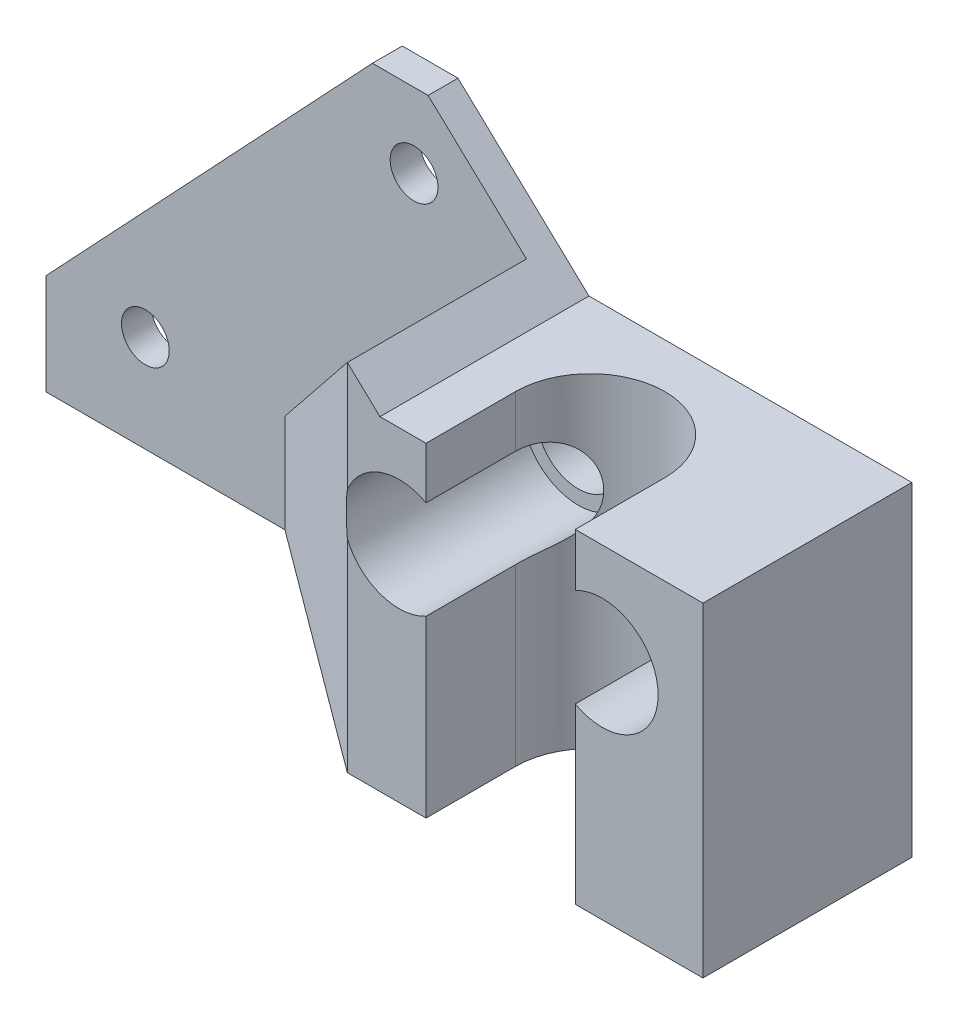
ISO-10303-21;
HEADER;
FILE_DESCRIPTION(('STEP AP214'),'2;1');
FILE_NAME('part.step','',(''),(''),'','','');
FILE_SCHEMA(('AUTOMOTIVE_DESIGN { 1 0 10303 214 1 1 1 1 }'));
ENDSEC;
DATA;
#1=APPLICATION_CONTEXT('core data for automotive mechanical design processes');
#2=APPLICATION_PROTOCOL_DEFINITION('international standard','automotive_design',2000,#1);
#3=PRODUCT_CONTEXT('',#1,'mechanical');
#4=PRODUCT('Part','Part','',(#3));
#5=PRODUCT_RELATED_PRODUCT_CATEGORY('part','',(#4));
#6=PRODUCT_DEFINITION_FORMATION('','',#4);
#7=PRODUCT_DEFINITION_CONTEXT('part definition',#1,'design');
#8=PRODUCT_DEFINITION('design','',#6,#7);
#9=PRODUCT_DEFINITION_SHAPE('','',#8);
#10=(LENGTH_UNIT() NAMED_UNIT(*) SI_UNIT(.MILLI.,.METRE.));
#11=(NAMED_UNIT(*) PLANE_ANGLE_UNIT() SI_UNIT($,.RADIAN.));
#12=(NAMED_UNIT(*) SI_UNIT($,.STERADIAN.) SOLID_ANGLE_UNIT());
#13=UNCERTAINTY_MEASURE_WITH_UNIT(LENGTH_MEASURE(1.E-05),#10,'distance_accuracy_value','');
#14=(GEOMETRIC_REPRESENTATION_CONTEXT(3) GLOBAL_UNCERTAINTY_ASSIGNED_CONTEXT((#13)) GLOBAL_UNIT_ASSIGNED_CONTEXT((#10,
#11,#12)) REPRESENTATION_CONTEXT('',''));
#15=CARTESIAN_POINT('',(0.,0.,0.));
#16=DIRECTION('',(0.,0.,1.));
#17=DIRECTION('',(1.,0.,0.));
#18=AXIS2_PLACEMENT_3D('',#15,#16,#17);
#19=CARTESIAN_POINT('',(0.,0.,14.));
#20=DIRECTION('',(0.,0.,1.));
#21=DIRECTION('',(1.,0.,0.));
#22=AXIS2_PLACEMENT_3D('',#19,#20,#21);
#23=PLANE('',#22);
#24=DIRECTION('',(0.,1.,0.));
#25=VECTOR('',#24,1.);
#26=CARTESIAN_POINT('',(7.51866515560034,0.477324022586538,14.));
#27=LINE('',#26,#25);
#28=CARTESIAN_POINT('',(7.51866515560034,0.477324022586538,14.));
#29=VERTEX_POINT('',#28);
#30=CARTESIAN_POINT('',(7.51866515560034,14.0531464838984,14.));
#31=VERTEX_POINT('',#30);
#32=EDGE_CURVE('E57',#29,#31,#27,.T.);
#33=ORIENTED_EDGE('',*,*,#32,.F.);
#34=DIRECTION('',(1.,0.,0.));
#35=VECTOR('',#34,1.);
#36=CARTESIAN_POINT('',(-8.66256915309688,0.477324022586538,14.));
#37=LINE('',#36,#35);
#38=CARTESIAN_POINT('',(12.787295144378,0.477324022586538,14.));
#39=VERTEX_POINT('',#38);
#40=EDGE_CURVE('E181',#29,#39,#37,.T.);
#41=ORIENTED_EDGE('',*,*,#40,.T.);
#42=DIRECTION('',(0.,1.,0.));
#43=VECTOR('',#42,1.);
#44=CARTESIAN_POINT('',(12.787295144378,0.477324022586538,14.));
#45=LINE('',#44,#43);
#46=CARTESIAN_POINT('',(12.787295144378,12.187344478267,14.));
#47=VERTEX_POINT('',#46);
#48=EDGE_CURVE('E359',#39,#47,#45,.T.);
#49=ORIENTED_EDGE('',*,*,#48,.T.);
#50=CARTESIAN_POINT('',(10.9877022465373,15.4773240225865,14.));
#51=DIRECTION('',(0.,0.,1.));
#52=DIRECTION('',(1.,0.,0.));
#53=AXIS2_PLACEMENT_3D('',#50,#51,#52);
#54=CIRCLE('',#53,3.75);
#55=EDGE_CURVE('E183',#31,#47,#54,.T.);
#56=ORIENTED_EDGE('',*,*,#55,.F.);
#57=EDGE_LOOP('',(#33,#41,#49,#56));
#58=FACE_BOUND('',#57,.T.);
#59=ADVANCED_FACE('F42',(#58),#23,.T.);
#60=CARTESIAN_POINT('',(7.51866515560034,16.9015015612747,14.));
#61=VERTEX_POINT('',#60);
#62=CARTESIAN_POINT('',(7.51866515560034,24.2822957667511,14.));
#63=VERTEX_POINT('',#62);
#64=EDGE_CURVE('E176',#61,#63,#27,.T.);
#65=ORIENTED_EDGE('',*,*,#64,.F.);
#66=CARTESIAN_POINT('',(12.787295144378,18.7673035669061,14.));
#67=VERTEX_POINT('',#66);
#68=EDGE_CURVE('E217',#67,#61,#54,.T.);
#69=ORIENTED_EDGE('',*,*,#68,.F.);
#70=CARTESIAN_POINT('',(12.787295144378,22.2273240225865,14.));
#71=VERTEX_POINT('',#70);
#72=EDGE_CURVE('E495',#67,#71,#45,.T.);
#73=ORIENTED_EDGE('',*,*,#72,.T.);
#74=DIRECTION('',(-1.,0.,0.));
#75=VECTOR('',#74,1.);
#76=CARTESIAN_POINT('',(9.70432092234068,22.2273240225866,14.));
#77=LINE('',#76,#75);
#78=CARTESIAN_POINT('',(9.70432092234068,22.2273240225866,14.));
#79=VERTEX_POINT('',#78);
#80=EDGE_CURVE('E199',#71,#79,#77,.T.);
#81=ORIENTED_EDGE('',*,*,#80,.T.);
#82=DIRECTION('',(-0.728551922246781,0.684990581388183,0.));
#83=VECTOR('',#82,1.);
#84=CARTESIAN_POINT('',(7.51866515560034,24.2822957667511,14.));
#85=LINE('',#84,#83);
#86=EDGE_CURVE('E210',#79,#63,#85,.T.);
#87=ORIENTED_EDGE('',*,*,#86,.T.);
#88=EDGE_LOOP('',(#65,#69,#73,#81,#87));
#89=FACE_BOUND('',#88,.T.);
#90=ADVANCED_FACE('F375',(#89),#23,.T.);
#91=CARTESIAN_POINT('',(0.,0.,2.));
#92=DIRECTION('',(0.,0.,-1.));
#93=DIRECTION('',(-1.,0.,0.));
#94=AXIS2_PLACEMENT_3D('',#91,#92,#93);
#95=PLANE('',#94);
#96=CARTESIAN_POINT('',(10.9877022465373,15.4773240225865,2.));
#97=DIRECTION('',(0.,0.,1.));
#98=DIRECTION('',(1.,0.,0.));
#99=AXIS2_PLACEMENT_3D('',#96,#97,#98);
#100=CIRCLE('',#99,2.8);
#101=CARTESIAN_POINT('',(13.7877022465373,15.4773240225865,2.));
#102=VERTEX_POINT('',#101);
#103=EDGE_CURVE('E242',#102,#102,#100,.T.);
#104=ORIENTED_EDGE('',*,*,#103,.F.);
#105=EDGE_LOOP('',(#104));
#106=FACE_BOUND('',#105,.T.);
#107=CARTESIAN_POINT('',(10.9877022465373,15.4773240225865,2.));
#108=DIRECTION('',(0.,0.,1.));
#109=DIRECTION('',(1.,0.,0.));
#110=AXIS2_PLACEMENT_3D('',#107,#108,#109);
#111=CIRCLE('',#110,3.75);
#112=CARTESIAN_POINT('',(14.7377022465373,15.4773240225865,2.));
#113=VERTEX_POINT('',#112);
#114=EDGE_CURVE('E203',#113,#113,#111,.T.);
#115=ORIENTED_EDGE('',*,*,#114,.T.);
#116=EDGE_LOOP('',(#115));
#117=FACE_BOUND('',#116,.T.);
#118=ADVANCED_FACE('F400',(#106,#117),#95,.F.);
#119=CARTESIAN_POINT('',(24.5874308469031,15.3914054774941,2.));
#120=DIRECTION('',(0.,0.,1.));
#121=DIRECTION('',(1.,0.,0.));
#122=AXIS2_PLACEMENT_3D('',#119,#120,#121);
#123=CIRCLE('',#122,2.8);
#124=CARTESIAN_POINT('',(27.3874308469031,15.3914054774941,2.));
#125=VERTEX_POINT('',#124);
#126=EDGE_CURVE('E250',#125,#125,#123,.T.);
#127=ORIENTED_EDGE('',*,*,#126,.F.);
#128=EDGE_LOOP('',(#127));
#129=FACE_BOUND('',#128,.T.);
#130=CARTESIAN_POINT('',(24.5874308469031,15.3914054774941,2.));
#131=DIRECTION('',(0.,0.,1.));
#132=DIRECTION('',(1.,0.,0.));
#133=AXIS2_PLACEMENT_3D('',#130,#131,#132);
#134=CIRCLE('',#133,3.75);
#135=CARTESIAN_POINT('',(28.3374308469031,15.3914054774941,2.));
#136=VERTEX_POINT('',#135);
#137=EDGE_CURVE('E358',#136,#136,#134,.T.);
#138=ORIENTED_EDGE('',*,*,#137,.T.);
#139=EDGE_LOOP('',(#138));
#140=FACE_BOUND('',#139,.T.);
#141=ADVANCED_FACE('F401',(#129,#140),#95,.F.);
#142=CARTESIAN_POINT('',(-24.6625691530969,0.477324022586537,2.));
#143=DIRECTION('',(1.,0.,0.));
#144=DIRECTION('',(0.,1.,0.));
#145=AXIS2_PLACEMENT_3D('',#142,#143,#144);
#146=PLANE('',#145);
#147=DIRECTION('',(0.,-1.,0.));
#148=VECTOR('',#147,1.);
#149=CARTESIAN_POINT('',(-24.6625691530969,0.477324022586537,0.));
#150=LINE('',#149,#148);
#151=CARTESIAN_POINT('',(-24.6625691530969,7.22803975017506,0.));
#152=VERTEX_POINT('',#151);
#153=CARTESIAN_POINT('',(-24.6625691530969,0.477324022586537,0.));
#154=VERTEX_POINT('',#153);
#155=EDGE_CURVE('E229',#152,#154,#150,.T.);
#156=ORIENTED_EDGE('',*,*,#155,.T.);
#157=DIRECTION('',(0.,0.,-1.));
#158=VECTOR('',#157,1.);
#159=CARTESIAN_POINT('',(-24.6625691530969,0.477324022586537,2.));
#160=LINE('',#159,#158);
#161=CARTESIAN_POINT('',(-24.6625691530969,0.477324022586537,2.));
#162=VERTEX_POINT('',#161);
#163=EDGE_CURVE('E318',#162,#154,#160,.T.);
#164=ORIENTED_EDGE('',*,*,#163,.F.);
#165=DIRECTION('',(0.,-1.,0.));
#166=VECTOR('',#165,1.);
#167=CARTESIAN_POINT('',(-24.6625691530969,0.477324022586537,2.));
#168=LINE('',#167,#166);
#169=CARTESIAN_POINT('',(-24.6625691530969,7.22803975017506,2.));
#170=VERTEX_POINT('',#169);
#171=EDGE_CURVE('E257',#170,#162,#168,.T.);
#172=ORIENTED_EDGE('',*,*,#171,.F.);
#173=DIRECTION('',(0.,0.,-1.));
#174=VECTOR('',#173,1.);
#175=CARTESIAN_POINT('',(-24.6625691530969,7.22803975017506,2.));
#176=LINE('',#175,#174);
#177=EDGE_CURVE('E274',#170,#152,#176,.T.);
#178=ORIENTED_EDGE('',*,*,#177,.T.);
#179=EDGE_LOOP('',(#156,#164,#172,#178));
#180=FACE_BOUND('',#179,.T.);
#181=ADVANCED_FACE('F44',(#180),#146,.F.);
#182=CARTESIAN_POINT('',(31.3374308469031,0.477324022586544,2.));
#183=DIRECTION('',(0.,1.,0.));
#184=DIRECTION('',(-1.,0.,0.));
#185=AXIS2_PLACEMENT_3D('',#182,#183,#184);
#186=PLANE('',#185);
#187=ORIENTED_EDGE('',*,*,#40,.F.);
#188=DIRECTION('',(-0.80322703688455,0.,-0.595673003599849));
#189=VECTOR('',#188,1.);
#190=CARTESIAN_POINT('',(-8.66256915309688,0.477324022586538,2.));
#191=LINE('',#190,#189);
#192=CARTESIAN_POINT('',(-8.66256915309688,0.477324022586538,2.));
#193=VERTEX_POINT('',#192);
#194=EDGE_CURVE('E168',#29,#193,#191,.T.);
#195=ORIENTED_EDGE('',*,*,#194,.T.);
#196=DIRECTION('',(1.,0.,0.));
#197=VECTOR('',#196,1.);
#198=CARTESIAN_POINT('',(31.3374308469031,0.477324022586544,2.));
#199=LINE('',#198,#197);
#200=EDGE_CURVE('E261',#162,#193,#199,.T.);
#201=ORIENTED_EDGE('',*,*,#200,.F.);
#202=ORIENTED_EDGE('',*,*,#163,.T.);
#203=DIRECTION('',(1.,0.,0.));
#204=VECTOR('',#203,1.);
#205=CARTESIAN_POINT('',(31.3374308469031,0.477324022586544,0.));
#206=LINE('',#205,#204);
#207=CARTESIAN_POINT('',(31.3374308469031,0.477324022586544,0.));
#208=VERTEX_POINT('',#207);
#209=EDGE_CURVE('E278',#154,#208,#206,.T.);
#210=ORIENTED_EDGE('',*,*,#209,.T.);
#211=DIRECTION('',(0.,0.,-1.));
#212=VECTOR('',#211,1.);
#213=CARTESIAN_POINT('',(31.3374308469031,0.477324022586544,2.));
#214=LINE('',#213,#212);
#215=CARTESIAN_POINT('',(31.3374308469031,0.477324022586544,14.));
#216=VERTEX_POINT('',#215);
#217=EDGE_CURVE('E314',#216,#208,#214,.T.);
#218=ORIENTED_EDGE('',*,*,#217,.F.);
#219=CARTESIAN_POINT('',(22.787295144378,0.477324022586538,14.));
#220=VERTEX_POINT('',#219);
#221=EDGE_CURVE('E194',#220,#216,#37,.T.);
#222=ORIENTED_EDGE('',*,*,#221,.F.);
#223=DIRECTION('',(0.,0.,-1.));
#224=VECTOR('',#223,1.);
#225=CARTESIAN_POINT('',(22.787295144378,0.477324022586538,14.));
#226=LINE('',#225,#224);
#227=CARTESIAN_POINT('',(22.787295144378,0.477324022586538,8.));
#228=VERTEX_POINT('',#227);
#229=EDGE_CURVE('E479',#220,#228,#226,.T.);
#230=ORIENTED_EDGE('',*,*,#229,.T.);
#231=CARTESIAN_POINT('',(17.787295144378,0.477324022586538,8.));
#232=DIRECTION('',(0.,1.,0.));
#233=DIRECTION('',(0.,0.,1.));
#234=AXIS2_PLACEMENT_3D('',#231,#232,#233);
#235=CIRCLE('',#234,5.);
#236=CARTESIAN_POINT('',(12.787295144378,0.477324022586538,8.));
#237=VERTEX_POINT('',#236);
#238=EDGE_CURVE('E476',#228,#237,#235,.T.);
#239=ORIENTED_EDGE('',*,*,#238,.T.);
#240=DIRECTION('',(0.,0.,1.));
#241=VECTOR('',#240,1.);
#242=CARTESIAN_POINT('',(12.787295144378,0.477324022586538,14.));
#243=LINE('',#242,#241);
#244=EDGE_CURVE('E191',#237,#39,#243,.T.);
#245=ORIENTED_EDGE('',*,*,#244,.T.);
#246=EDGE_LOOP('',(#187,#195,#201,#202,#210,#218,#222,#230,#239,#245));
#247=FACE_BOUND('',#246,.T.);
#248=ADVANCED_FACE('F188',(#247),#186,.F.);
#249=CARTESIAN_POINT('',(31.3374308469031,22.2273240225865,2.));
#250=DIRECTION('',(-1.,0.,0.));
#251=DIRECTION('',(0.,-1.,0.));
#252=AXIS2_PLACEMENT_3D('',#249,#250,#251);
#253=PLANE('',#252);
#254=DIRECTION('',(0.,1.,0.));
#255=VECTOR('',#254,1.);
#256=CARTESIAN_POINT('',(31.3374308469031,22.2273240225865,0.));
#257=LINE('',#256,#255);
#258=CARTESIAN_POINT('',(31.3374308469031,22.2273240225865,0.));
#259=VERTEX_POINT('',#258);
#260=EDGE_CURVE('E281',#208,#259,#257,.T.);
#261=ORIENTED_EDGE('',*,*,#260,.T.);
#262=DIRECTION('',(0.,0.,-1.));
#263=VECTOR('',#262,1.);
#264=CARTESIAN_POINT('',(31.3374308469031,22.2273240225865,2.));
#265=LINE('',#264,#263);
#266=CARTESIAN_POINT('',(31.3374308469031,22.2273240225865,14.));
#267=VERTEX_POINT('',#266);
#268=EDGE_CURVE('E310',#267,#259,#265,.T.);
#269=ORIENTED_EDGE('',*,*,#268,.F.);
#270=DIRECTION('',(0.,1.,0.));
#271=VECTOR('',#270,1.);
#272=CARTESIAN_POINT('',(31.3374308469031,0.477324022586544,14.));
#273=LINE('',#272,#271);
#274=EDGE_CURVE('E193',#216,#267,#273,.T.);
#275=ORIENTED_EDGE('',*,*,#274,.F.);
#276=ORIENTED_EDGE('',*,*,#217,.T.);
#277=EDGE_LOOP('',(#261,#269,#275,#276));
#278=FACE_BOUND('',#277,.T.);
#279=ADVANCED_FACE('F419',(#278),#253,.F.);
#280=CARTESIAN_POINT('',(9.70432092234068,22.2273240225865,2.));
#281=DIRECTION('',(0.,-1.,0.));
#282=DIRECTION('',(0.,0.,-1.));
#283=AXIS2_PLACEMENT_3D('',#280,#281,#282);
#284=PLANE('',#283);
#285=ORIENTED_EDGE('',*,*,#80,.F.);
#286=DIRECTION('',(0.,0.,1.));
#287=VECTOR('',#286,1.);
#288=CARTESIAN_POINT('',(12.787295144378,22.2273240225865,14.));
#289=LINE('',#288,#287);
#290=CARTESIAN_POINT('',(12.787295144378,22.2273240225865,8.));
#291=VERTEX_POINT('',#290);
#292=EDGE_CURVE('E490',#291,#71,#289,.T.);
#293=ORIENTED_EDGE('',*,*,#292,.F.);
#294=CARTESIAN_POINT('',(17.787295144378,22.2273240225865,8.));
#295=DIRECTION('',(0.,1.,0.));
#296=DIRECTION('',(0.,0.,1.));
#297=AXIS2_PLACEMENT_3D('',#294,#295,#296);
#298=CIRCLE('',#297,5.);
#299=CARTESIAN_POINT('',(22.787295144378,22.2273240225865,8.));
#300=VERTEX_POINT('',#299);
#301=EDGE_CURVE('E486',#300,#291,#298,.T.);
#302=ORIENTED_EDGE('',*,*,#301,.F.);
#303=DIRECTION('',(0.,0.,-1.));
#304=VECTOR('',#303,1.);
#305=CARTESIAN_POINT('',(22.787295144378,22.2273240225865,14.));
#306=LINE('',#305,#304);
#307=CARTESIAN_POINT('',(22.787295144378,22.2273240225865,14.));
#308=VERTEX_POINT('',#307);
#309=EDGE_CURVE('E483',#308,#300,#306,.T.);
#310=ORIENTED_EDGE('',*,*,#309,.F.);
#311=EDGE_CURVE('E206',#267,#308,#77,.T.);
#312=ORIENTED_EDGE('',*,*,#311,.F.);
#313=ORIENTED_EDGE('',*,*,#268,.T.);
#314=DIRECTION('',(-1.,0.,0.));
#315=VECTOR('',#314,1.);
#316=CARTESIAN_POINT('',(9.70432092234068,22.2273240225865,0.));
#317=LINE('',#316,#315);
#318=CARTESIAN_POINT('',(9.70432092234068,22.2273240225865,0.));
#319=VERTEX_POINT('',#318);
#320=EDGE_CURVE('E284',#259,#319,#317,.T.);
#321=ORIENTED_EDGE('',*,*,#320,.T.);
#322=DIRECTION('',(0.,0.,-1.));
#323=VECTOR('',#322,1.);
#324=CARTESIAN_POINT('',(9.70432092234068,22.2273240225865,2.));
#325=LINE('',#324,#323);
#326=EDGE_CURVE('E306',#79,#319,#325,.T.);
#327=ORIENTED_EDGE('',*,*,#326,.F.);
#328=EDGE_LOOP('',(#285,#293,#302,#310,#312,#313,#321,#327));
#329=FACE_BOUND('',#328,.T.);
#330=ADVANCED_FACE('F415',(#329),#284,.F.);
#331=CARTESIAN_POINT('',(0.929669822240732,30.4773240225865,2.));
#332=DIRECTION('',(-0.684990581388184,-0.72855192224678,0.));
#333=DIRECTION('',(0.72855192224678,-0.684990581388184,0.));
#334=AXIS2_PLACEMENT_3D('',#331,#332,#333);
#335=PLANE('',#334);
#336=DIRECTION('',(-0.72855192224678,0.684990581388184,0.));
#337=VECTOR('',#336,1.);
#338=CARTESIAN_POINT('',(0.929669822240732,30.4773240225865,0.));
#339=LINE('',#338,#337);
#340=CARTESIAN_POINT('',(0.929669822240732,30.4773240225865,0.));
#341=VERTEX_POINT('',#340);
#342=EDGE_CURVE('E287',#319,#341,#339,.T.);
#343=ORIENTED_EDGE('',*,*,#342,.T.);
#344=DIRECTION('',(0.,0.,-1.));
#345=VECTOR('',#344,1.);
#346=CARTESIAN_POINT('',(0.929669822240732,30.4773240225865,2.));
#347=LINE('',#346,#345);
#348=CARTESIAN_POINT('',(0.929669822240732,30.4773240225865,2.));
#349=VERTEX_POINT('',#348);
#350=EDGE_CURVE('E302',#349,#341,#347,.T.);
#351=ORIENTED_EDGE('',*,*,#350,.F.);
#352=DIRECTION('',(-0.72855192224678,0.684990581388184,0.));
#353=VECTOR('',#352,1.);
#354=CARTESIAN_POINT('',(0.929669822240732,30.4773240225865,2.));
#355=LINE('',#354,#353);
#356=CARTESIAN_POINT('',(7.51866515560034,24.2822957667511,2.));
#357=VERTEX_POINT('',#356);
#358=EDGE_CURVE('E265',#357,#349,#355,.T.);
#359=ORIENTED_EDGE('',*,*,#358,.F.);
#360=DIRECTION('',(0.,0.,-1.));
#361=VECTOR('',#360,1.);
#362=CARTESIAN_POINT('',(7.51866515560034,24.2822957667511,14.));
#363=LINE('',#362,#361);
#364=EDGE_CURVE('E214',#63,#357,#363,.T.);
#365=ORIENTED_EDGE('',*,*,#364,.F.);
#366=ORIENTED_EDGE('',*,*,#86,.F.);
#367=ORIENTED_EDGE('',*,*,#326,.T.);
#368=EDGE_LOOP('',(#343,#351,#359,#365,#366,#367));
#369=FACE_BOUND('',#368,.T.);
#370=ADVANCED_FACE('F411',(#369),#335,.F.);
#371=CARTESIAN_POINT('',(-2.80339856508229,30.4773240225865,2.));
#372=DIRECTION('',(0.,-1.,0.));
#373=DIRECTION('',(0.,0.,-1.));
#374=AXIS2_PLACEMENT_3D('',#371,#372,#373);
#375=PLANE('',#374);
#376=DIRECTION('',(-1.,0.,0.));
#377=VECTOR('',#376,1.);
#378=CARTESIAN_POINT('',(-2.80339856508229,30.4773240225865,0.));
#379=LINE('',#378,#377);
#380=CARTESIAN_POINT('',(-2.80339856508229,30.4773240225865,0.));
#381=VERTEX_POINT('',#380);
#382=EDGE_CURVE('E290',#341,#381,#379,.T.);
#383=ORIENTED_EDGE('',*,*,#382,.T.);
#384=DIRECTION('',(0.,0.,-1.));
#385=VECTOR('',#384,1.);
#386=CARTESIAN_POINT('',(-2.80339856508229,30.4773240225865,2.));
#387=LINE('',#386,#385);
#388=CARTESIAN_POINT('',(-2.80339856508229,30.4773240225865,2.));
#389=VERTEX_POINT('',#388);
#390=EDGE_CURVE('E298',#389,#381,#387,.T.);
#391=ORIENTED_EDGE('',*,*,#390,.F.);
#392=DIRECTION('',(-1.,0.,0.));
#393=VECTOR('',#392,1.);
#394=CARTESIAN_POINT('',(-2.80339856508229,30.4773240225865,2.));
#395=LINE('',#394,#393);
#396=EDGE_CURVE('E268',#349,#389,#395,.T.);
#397=ORIENTED_EDGE('',*,*,#396,.F.);
#398=ORIENTED_EDGE('',*,*,#350,.T.);
#399=EDGE_LOOP('',(#383,#391,#397,#398));
#400=FACE_BOUND('',#399,.T.);
#401=ADVANCED_FACE('F407',(#400),#375,.F.);
#402=CARTESIAN_POINT('',(-24.6625691530969,7.22803975017506,2.));
#403=DIRECTION('',(0.72855192224678,-0.684990581388184,0.));
#404=DIRECTION('',(0.684990581388184,0.72855192224678,0.));
#405=AXIS2_PLACEMENT_3D('',#402,#403,#404);
#406=PLANE('',#405);
#407=DIRECTION('',(-0.684990581388184,-0.72855192224678,0.));
#408=VECTOR('',#407,1.);
#409=CARTESIAN_POINT('',(-24.6625691530969,7.22803975017506,0.));
#410=LINE('',#409,#408);
#411=EDGE_CURVE('E262',#381,#152,#410,.T.);
#412=ORIENTED_EDGE('',*,*,#411,.T.);
#413=ORIENTED_EDGE('',*,*,#177,.F.);
#414=DIRECTION('',(-0.684990581388184,-0.72855192224678,0.));
#415=VECTOR('',#414,1.);
#416=CARTESIAN_POINT('',(-24.6625691530969,7.22803975017506,2.));
#417=LINE('',#416,#415);
#418=EDGE_CURVE('E271',#389,#170,#417,.T.);
#419=ORIENTED_EDGE('',*,*,#418,.F.);
#420=ORIENTED_EDGE('',*,*,#390,.T.);
#421=EDGE_LOOP('',(#412,#413,#419,#420));
#422=FACE_BOUND('',#421,.T.);
#423=ADVANCED_FACE('F398',(#422),#406,.F.);
#424=ORIENTED_EDGE('',*,*,#418,.T.);
#425=ORIENTED_EDGE('',*,*,#171,.T.);
#426=ORIENTED_EDGE('',*,*,#200,.T.);
#427=DIRECTION('',(0.,-1.,0.));
#428=VECTOR('',#427,1.);
#429=CARTESIAN_POINT('',(-8.66256915309688,7.0720308664135,2.));
#430=LINE('',#429,#428);
#431=CARTESIAN_POINT('',(-8.66256915309688,7.0720308664135,2.));
#432=VERTEX_POINT('',#431);
#433=EDGE_CURVE('E171',#432,#193,#430,.T.);
#434=ORIENTED_EDGE('',*,*,#433,.F.);
#435=DIRECTION('',(-0.684990581388184,-0.72855192224678,0.));
#436=VECTOR('',#435,1.);
#437=CARTESIAN_POINT('',(-8.66256915309688,7.0720308664135,2.));
#438=LINE('',#437,#436);
#439=EDGE_CURVE('E201',#357,#432,#438,.T.);
#440=ORIENTED_EDGE('',*,*,#439,.F.);
#441=ORIENTED_EDGE('',*,*,#358,.T.);
#442=ORIENTED_EDGE('',*,*,#396,.T.);
#443=EDGE_LOOP('',(#424,#425,#426,#434,#440,#441,#442));
#444=FACE_BOUND('',#443,.T.);
#445=CARTESIAN_POINT('',(-0.0122977534627443,25.4773240225865,2.));
#446=DIRECTION('',(0.,0.,1.));
#447=DIRECTION('',(1.,0.,0.));
#448=AXIS2_PLACEMENT_3D('',#445,#446,#447);
#449=CIRCLE('',#448,1.6);
#450=CARTESIAN_POINT('',(1.58770224653726,25.4773240225865,2.));
#451=VERTEX_POINT('',#450);
#452=EDGE_CURVE('E230',#451,#451,#449,.T.);
#453=ORIENTED_EDGE('',*,*,#452,.F.);
#454=EDGE_LOOP('',(#453));
#455=FACE_BOUND('',#454,.T.);
#456=CARTESIAN_POINT('',(-18.0122977534627,6.97732402258655,2.));
#457=DIRECTION('',(0.,0.,1.));
#458=DIRECTION('',(1.,0.,0.));
#459=AXIS2_PLACEMENT_3D('',#456,#457,#458);
#460=CIRCLE('',#459,1.6);
#461=CARTESIAN_POINT('',(-16.4122977534627,6.97732402258655,2.));
#462=VERTEX_POINT('',#461);
#463=EDGE_CURVE('E234',#462,#462,#460,.T.);
#464=ORIENTED_EDGE('',*,*,#463,.F.);
#465=EDGE_LOOP('',(#464));
#466=FACE_BOUND('',#465,.T.);
#467=ADVANCED_FACE('F395',(#444,#455,#466),#95,.F.);
#468=CARTESIAN_POINT('',(0.,0.,0.));
#469=DIRECTION('',(0.,0.,-1.));
#470=DIRECTION('',(-1.,0.,0.));
#471=AXIS2_PLACEMENT_3D('',#468,#469,#470);
#472=PLANE('',#471);
#473=CARTESIAN_POINT('',(-0.0122977534627443,25.4773240225865,0.));
#474=DIRECTION('',(0.,0.,1.));
#475=DIRECTION('',(1.,0.,0.));
#476=AXIS2_PLACEMENT_3D('',#473,#474,#475);
#477=CIRCLE('',#476,1.6);
#478=CARTESIAN_POINT('',(1.58770224653726,25.4773240225865,0.));
#479=VERTEX_POINT('',#478);
#480=EDGE_CURVE('E225',#479,#479,#477,.T.);
#481=ORIENTED_EDGE('',*,*,#480,.T.);
#482=EDGE_LOOP('',(#481));
#483=FACE_BOUND('',#482,.T.);
#484=CARTESIAN_POINT('',(-18.0122977534627,6.97732402258655,0.));
#485=DIRECTION('',(0.,0.,1.));
#486=DIRECTION('',(1.,0.,0.));
#487=AXIS2_PLACEMENT_3D('',#484,#485,#486);
#488=CIRCLE('',#487,1.6);
#489=CARTESIAN_POINT('',(-16.4122977534627,6.97732402258655,0.));
#490=VERTEX_POINT('',#489);
#491=EDGE_CURVE('E238',#490,#490,#488,.T.);
#492=ORIENTED_EDGE('',*,*,#491,.T.);
#493=EDGE_LOOP('',(#492));
#494=FACE_BOUND('',#493,.T.);
#495=CARTESIAN_POINT('',(10.9877022465373,15.4773240225865,0.));
#496=DIRECTION('',(0.,0.,1.));
#497=DIRECTION('',(1.,0.,0.));
#498=AXIS2_PLACEMENT_3D('',#495,#496,#497);
#499=CIRCLE('',#498,2.8);
#500=CARTESIAN_POINT('',(13.7877022465373,15.4773240225865,0.));
#501=VERTEX_POINT('',#500);
#502=EDGE_CURVE('E246',#501,#501,#499,.T.);
#503=ORIENTED_EDGE('',*,*,#502,.T.);
#504=EDGE_LOOP('',(#503));
#505=FACE_BOUND('',#504,.T.);
#506=CARTESIAN_POINT('',(24.5874308469031,15.3914054774941,0.));
#507=DIRECTION('',(0.,0.,1.));
#508=DIRECTION('',(1.,0.,0.));
#509=AXIS2_PLACEMENT_3D('',#506,#507,#508);
#510=CIRCLE('',#509,2.8);
#511=CARTESIAN_POINT('',(27.3874308469031,15.3914054774941,0.));
#512=VERTEX_POINT('',#511);
#513=EDGE_CURVE('E224',#512,#512,#510,.T.);
#514=ORIENTED_EDGE('',*,*,#513,.T.);
#515=EDGE_LOOP('',(#514));
#516=FACE_BOUND('',#515,.T.);
#517=ORIENTED_EDGE('',*,*,#155,.F.);
#518=ORIENTED_EDGE('',*,*,#411,.F.);
#519=ORIENTED_EDGE('',*,*,#382,.F.);
#520=ORIENTED_EDGE('',*,*,#342,.F.);
#521=ORIENTED_EDGE('',*,*,#320,.F.);
#522=ORIENTED_EDGE('',*,*,#260,.F.);
#523=ORIENTED_EDGE('',*,*,#209,.F.);
#524=EDGE_LOOP('',(#517,#518,#519,#520,#521,#522,#523));
#525=FACE_BOUND('',#524,.T.);
#526=ADVANCED_FACE('F393',(#483,#494,#505,#516,#525),#472,.T.);
#527=CARTESIAN_POINT('',(24.5874308469031,15.3914054774941,0.));
#528=DIRECTION('',(0.,0.,1.));
#529=DIRECTION('',(1.,0.,0.));
#530=AXIS2_PLACEMENT_3D('',#527,#528,#529);
#531=CYLINDRICAL_SURFACE('',#530,2.8);
#532=ORIENTED_EDGE('',*,*,#513,.F.);
#533=EDGE_LOOP('',(#532));
#534=FACE_BOUND('',#533,.T.);
#535=ORIENTED_EDGE('',*,*,#126,.T.);
#536=EDGE_LOOP('',(#535));
#537=FACE_BOUND('',#536,.T.);
#538=ADVANCED_FACE('F389',(#534,#537),#531,.F.);
#539=CARTESIAN_POINT('',(10.9877022465373,15.4773240225865,0.));
#540=DIRECTION('',(0.,0.,1.));
#541=DIRECTION('',(1.,0.,0.));
#542=AXIS2_PLACEMENT_3D('',#539,#540,#541);
#543=CYLINDRICAL_SURFACE('',#542,2.8);
#544=ORIENTED_EDGE('',*,*,#502,.F.);
#545=EDGE_LOOP('',(#544));
#546=FACE_BOUND('',#545,.T.);
#547=ORIENTED_EDGE('',*,*,#103,.T.);
#548=EDGE_LOOP('',(#547));
#549=FACE_BOUND('',#548,.T.);
#550=ADVANCED_FACE('F385',(#546,#549),#543,.F.);
#551=CARTESIAN_POINT('',(-18.0122977534627,6.97732402258655,0.));
#552=DIRECTION('',(0.,0.,1.));
#553=DIRECTION('',(1.,0.,0.));
#554=AXIS2_PLACEMENT_3D('',#551,#552,#553);
#555=CYLINDRICAL_SURFACE('',#554,1.6);
#556=ORIENTED_EDGE('',*,*,#491,.F.);
#557=EDGE_LOOP('',(#556));
#558=FACE_BOUND('',#557,.T.);
#559=ORIENTED_EDGE('',*,*,#463,.T.);
#560=EDGE_LOOP('',(#559));
#561=FACE_BOUND('',#560,.T.);
#562=ADVANCED_FACE('F381',(#558,#561),#555,.F.);
#563=CARTESIAN_POINT('',(-0.0122977534627443,25.4773240225865,0.));
#564=DIRECTION('',(0.,0.,1.));
#565=DIRECTION('',(1.,0.,0.));
#566=AXIS2_PLACEMENT_3D('',#563,#564,#565);
#567=CYLINDRICAL_SURFACE('',#566,1.6);
#568=ORIENTED_EDGE('',*,*,#480,.F.);
#569=EDGE_LOOP('',(#568));
#570=FACE_BOUND('',#569,.T.);
#571=ORIENTED_EDGE('',*,*,#452,.T.);
#572=EDGE_LOOP('',(#571));
#573=FACE_BOUND('',#572,.T.);
#574=ADVANCED_FACE('F373',(#570,#573),#567,.F.);
#575=DIRECTION('',(0.,1.,0.));
#576=VECTOR('',#575,1.);
#577=CARTESIAN_POINT('',(22.787295144378,0.477324022586538,14.));
#578=LINE('',#577,#576);
#579=CARTESIAN_POINT('',(22.787295144378,12.1017229012424,14.));
#580=VERTEX_POINT('',#579);
#581=EDGE_CURVE('E360',#220,#580,#578,.T.);
#582=ORIENTED_EDGE('',*,*,#581,.F.);
#583=ORIENTED_EDGE('',*,*,#221,.T.);
#584=ORIENTED_EDGE('',*,*,#274,.T.);
#585=ORIENTED_EDGE('',*,*,#311,.T.);
#586=CARTESIAN_POINT('',(22.787295144378,18.6810880537459,14.));
#587=VERTEX_POINT('',#586);
#588=EDGE_CURVE('E470',#587,#308,#578,.T.);
#589=ORIENTED_EDGE('',*,*,#588,.F.);
#590=CARTESIAN_POINT('',(24.5874308469031,15.3914054774941,14.));
#591=DIRECTION('',(0.,0.,1.));
#592=DIRECTION('',(1.,0.,0.));
#593=AXIS2_PLACEMENT_3D('',#590,#591,#592);
#594=CIRCLE('',#593,3.75);
#595=EDGE_CURVE('E362',#580,#587,#594,.T.);
#596=ORIENTED_EDGE('',*,*,#595,.F.);
#597=EDGE_LOOP('',(#582,#583,#584,#585,#589,#596));
#598=FACE_BOUND('',#597,.T.);
#599=ADVANCED_FACE('F370',(#598),#23,.T.);
#600=CARTESIAN_POINT('',(-8.66256915309688,7.0720308664135,14.));
#601=DIRECTION('',(0.72855192224678,-0.684990581388184,0.));
#602=DIRECTION('',(0.684990581388184,0.72855192224678,0.));
#603=AXIS2_PLACEMENT_3D('',#600,#601,#602);
#604=PLANE('',#603);
#605=ORIENTED_EDGE('',*,*,#439,.T.);
#606=DIRECTION('',(0.610710214368837,0.649547764164096,0.452902568037535));
#607=VECTOR('',#606,1.);
#608=CARTESIAN_POINT('',(-5.34346246012409,10.602213071849,4.46144883361993));
#609=LINE('',#608,#607);
#610=EDGE_CURVE('E185',#432,#63,#609,.T.);
#611=ORIENTED_EDGE('',*,*,#610,.T.);
#612=ORIENTED_EDGE('',*,*,#364,.T.);
#613=EDGE_LOOP('',(#605,#611,#612));
#614=FACE_BOUND('',#613,.T.);
#615=ADVANCED_FACE('F368',(#614),#604,.F.);
#616=CARTESIAN_POINT('',(10.9877022465373,15.4773240225865,14.));
#617=DIRECTION('',(0.,0.,-1.));
#618=DIRECTION('',(-1.,0.,0.));
#619=AXIS2_PLACEMENT_3D('',#616,#617,#618);
#620=CYLINDRICAL_SURFACE('',#619,3.75);
#621=CARTESIAN_POINT('',(10.9877022465373,15.4773240225865,16.5726371855865));
#622=DIRECTION('',(0.595673003599849,0.,-0.80322703688455));
#623=DIRECTION('',(-0.80322703688455,0.,-0.595673003599849));
#624=AXIS2_PLACEMENT_3D('',#621,#622,#623);
#625=ELLIPSE('',#624,4.66866754703004,3.75);
#626=EDGE_CURVE('E11',#31,#61,#625,.T.);
#627=ORIENTED_EDGE('',*,*,#626,.F.);
#628=ORIENTED_EDGE('',*,*,#55,.T.);
#629=DIRECTION('',(0.,0.,-1.));
#630=VECTOR('',#629,1.);
#631=CARTESIAN_POINT('',(12.787295144378,12.187344478267,14.));
#632=LINE('',#631,#630);
#633=CARTESIAN_POINT('',(12.787295144378,12.187344478267,8.));
#634=VERTEX_POINT('',#633);
#635=EDGE_CURVE('E529',#634,#47,#632,.F.);
#636=ORIENTED_EDGE('',*,*,#635,.F.);
#637=CARTESIAN_POINT('',(12.787295144378,18.7673035669061,8.));
#638=CARTESIAN_POINT('',(12.7872776427,18.7672684085139,7.88197046070592));
#639=CARTESIAN_POINT('',(12.7914737999434,18.7650162377579,7.76393520446742));
#640=CARTESIAN_POINT('',(12.8081733044343,18.7558229064236,7.5285985850598));
#641=CARTESIAN_POINT('',(12.8206794455543,18.748880168832,7.41129748211103));
#642=CARTESIAN_POINT('',(12.8539924309862,18.7299858798236,7.17745617944918));
#643=CARTESIAN_POINT('',(12.8748555906734,18.7180003181879,7.06092670833143));
#644=CARTESIAN_POINT('',(12.9246074109301,18.6885138541062,6.8303090749889));
#645=CARTESIAN_POINT('',(12.9534953019128,18.6710134805193,6.71622067978983));
#646=CARTESIAN_POINT('',(13.0190021603366,18.6297552539011,6.49096469773367));
#647=CARTESIAN_POINT('',(13.0556490979872,18.6059746828414,6.37980936001476));
#648=CARTESIAN_POINT('',(13.1359801845414,18.5513702379923,6.16186116517435));
#649=CARTESIAN_POINT('',(13.1796633214882,18.5205473767691,6.05506768348883));
#650=CARTESIAN_POINT('',(13.2730256057115,18.4510703514143,5.84726031925383));
#651=CARTESIAN_POINT('',(13.3226824183115,18.4124450128331,5.74622686907888));
#652=CARTESIAN_POINT('',(13.4268906350859,18.3264328488434,5.55068151127578));
#653=CARTESIAN_POINT('',(13.4814401146807,18.2790494607889,5.45616706498821));
#654=CARTESIAN_POINT('',(13.6206486212686,18.1499412566814,5.23165724182844));
#655=CARTESIAN_POINT('',(13.7073296437506,18.0625815634305,5.10606392525748));
#656=CARTESIAN_POINT('',(13.8818360835157,17.8655647349849,4.87455117652839));
#657=CARTESIAN_POINT('',(13.9696611303868,17.7559146568829,4.7686255378798));
#658=CARTESIAN_POINT('',(14.0968367144914,17.5752462428688,4.62588613775611));
#659=CARTESIAN_POINT('',(14.1385567080326,17.5121646509879,4.58091520833998));
#660=CARTESIAN_POINT('',(14.2195293023758,17.3809319034349,4.49650824726873));
#661=CARTESIAN_POINT('',(14.2587828477499,17.3127827105973,4.45707008951452));
#662=CARTESIAN_POINT('',(14.3339856443442,17.1718077856113,4.38372853012205));
#663=CARTESIAN_POINT('',(14.3699336770198,17.0989803455444,4.34982716602214));
#664=CARTESIAN_POINT('',(14.4377500904731,16.9492028806843,4.28749831082911));
#665=CARTESIAN_POINT('',(14.469618630004,16.87225301648,4.25907060670737));
#666=CARTESIAN_POINT('',(14.5267971788758,16.7197094929376,4.20915497076524));
#667=CARTESIAN_POINT('',(14.5523911990336,16.6443271821949,4.18734620028101));
#668=CARTESIAN_POINT('',(14.5989904862952,16.4909976722945,4.14829529868342));
#669=CARTESIAN_POINT('',(14.619994213449,16.4130496224434,4.13105469968799));
#670=CARTESIAN_POINT('',(14.675547246507,16.1762425950547,4.08600337097102));
#671=CARTESIAN_POINT('',(14.702698570646,16.0142623270458,4.06481256119201));
#672=CARTESIAN_POINT('',(14.7355145211608,15.6863672926488,4.03931035884586));
#673=CARTESIAN_POINT('',(14.7411056619754,15.5204410061784,4.03505669310694));
#674=CARTESIAN_POINT('',(14.7303120828178,15.1896966546447,4.043372446141));
#675=CARTESIAN_POINT('',(14.7139262357719,15.0248786468544,4.05594272771768));
#676=CARTESIAN_POINT('',(14.659902655993,14.6995993458566,4.09864090155443));
#677=CARTESIAN_POINT('',(14.622082283943,14.5391880828857,4.12891975682096));
#678=CARTESIAN_POINT('',(14.5275229408025,14.2289458713414,4.20821087582419));
#679=CARTESIAN_POINT('',(14.4707888295752,14.0791122168359,4.25721832774282));
#680=CARTESIAN_POINT('',(14.3431937361811,13.7959493276867,4.37432286390528));
#681=CARTESIAN_POINT('',(14.2725019120297,13.6624507886654,4.44219498962688));
#682=CARTESIAN_POINT('',(14.121935265566,13.4132773822703,4.59753193295801));
#683=CARTESIAN_POINT('',(14.0420616001358,13.2976002737428,4.68499428357701));
#684=CARTESIAN_POINT('',(13.8790120759694,13.0855033601242,4.87888239744261));
#685=CARTESIAN_POINT('',(13.795827686651,12.9891377600811,4.98535999479236));
#686=CARTESIAN_POINT('',(13.6323138834828,12.8159803656136,5.21503887441011));
#687=CARTESIAN_POINT('',(13.5519853335251,12.7391944514147,5.33824516370067));
#688=CARTESIAN_POINT('',(13.3928196627525,12.5980578279404,5.60933356280602));
#689=CARTESIAN_POINT('',(13.3146567847938,12.5352632414008,5.75841415743736));
#690=CARTESIAN_POINT('',(13.1719572588933,12.4278083434506,6.06921387732876));
#691=CARTESIAN_POINT('',(13.1074332418188,12.3831648065981,6.23094452951517));
#692=CARTESIAN_POINT('',(13.0185276380559,12.3245867177218,6.49358242486877));
#693=CARTESIAN_POINT('',(12.9886515006401,12.3056214310662,6.59159596367308));
#694=CARTESIAN_POINT('',(12.9348267888913,12.2722944340798,6.79000047990761));
#695=CARTESIAN_POINT('',(12.9108771672012,12.257931910198,6.89039103382153));
#696=CARTESIAN_POINT('',(12.8691822656191,12.2333887562084,7.09288753817397));
#697=CARTESIAN_POINT('',(12.8514336695276,12.2232058903818,7.19499254104011));
#698=CARTESIAN_POINT('',(12.8222969174605,12.2066905041565,7.40038040174921));
#699=CARTESIAN_POINT('',(12.810906353728,12.2003565261216,7.5036627985781));
#700=CARTESIAN_POINT('',(12.7975948478759,12.1929942557384,7.67260266498692));
#701=CARTESIAN_POINT('',(12.7937302128031,12.1908703964969,7.73806782354061));
#702=CARTESIAN_POINT('',(12.7885820389767,12.1880483018426,7.86902043332848));
#703=CARTESIAN_POINT('',(12.7872941889646,12.1873476851507,7.93450766366792));
#704=CARTESIAN_POINT('',(12.787295144378,12.187344478267,8.));
#705=B_SPLINE_CURVE_WITH_KNOTS('',3,(#637,#638,#639,#640,#641,#642,#643,#644,#645,#646,#647,
#648,#649,#650,#651,#652,#653,#654,#655,#656,#657,#658,#659,#660,#661,#662,#663,#664,#665,#666,
#667,#668,#669,#670,#671,#672,#673,#674,#675,#676,#677,#678,#679,#680,#681,#682,#683,#684,#685,
#686,#687,#688,#689,#690,#691,#692,#693,#694,#695,#696,#697,#698,#699,#700,#701,#702,#703,#704),
.UNSPECIFIED.,.F.,.F.,(4,2,2,2,2,2,2,2,2,2,2,2,2,2,2,2,2,2,2,2,2,2,2,2,2,2,2,2,2,2,2,2,2,4),(0.,
0.354001999957391,0.708123078028422,1.06467173151087,1.4211862031078,1.77900843072798,
2.13677924169973,2.49325171011817,2.84958456638348,3.37471968370716,3.89968880247578,
4.16335951670793,4.42692863002449,4.69059451920373,4.95425014473176,5.20157078564688,
5.44897427067646,5.94325742669424,6.43922381214195,6.93521563383354,7.43549864901373,
7.9356532160107,8.43008207152217,8.92444869874272,9.42018409389858,9.91606819479702,
10.4530125999254,10.9904521082776,11.3028115716594,11.6151157941658,11.9272527452932,
12.2392714112954,12.4360512039507,12.6325014850846),.UNSPECIFIED.);
#706=CARTESIAN_POINT('',(12.787295144378,18.7673035669061,8.));
#707=VERTEX_POINT('',#706);
#708=EDGE_CURVE('E350',#707,#634,#705,.T.);
#709=ORIENTED_EDGE('',*,*,#708,.F.);
#710=DIRECTION('',(0.,0.,-1.));
#711=VECTOR('',#710,1.);
#712=CARTESIAN_POINT('',(12.787295144378,18.7673035669061,14.));
#713=LINE('',#712,#711);
#714=EDGE_CURVE('E51',#67,#707,#713,.T.);
#715=ORIENTED_EDGE('',*,*,#714,.F.);
#716=ORIENTED_EDGE('',*,*,#68,.T.);
#717=EDGE_LOOP('',(#627,#628,#636,#709,#715,#716));
#718=FACE_BOUND('',#717,.T.);
#719=ORIENTED_EDGE('',*,*,#114,.F.);
#720=EDGE_LOOP('',(#719));
#721=FACE_BOUND('',#720,.T.);
#722=ADVANCED_FACE('F364',(#718,#721),#620,.F.);
#723=CARTESIAN_POINT('',(24.5874308469031,15.3914054774941,14.));
#724=DIRECTION('',(0.,0.,-1.));
#725=DIRECTION('',(-1.,0.,0.));
#726=AXIS2_PLACEMENT_3D('',#723,#724,#725);
#727=CYLINDRICAL_SURFACE('',#726,3.75);
#728=DIRECTION('',(0.,0.,-1.));
#729=VECTOR('',#728,1.);
#730=CARTESIAN_POINT('',(22.787295144378,12.1017229012424,14.));
#731=LINE('',#730,#729);
#732=CARTESIAN_POINT('',(22.787295144378,12.1017229012424,8.));
#733=VERTEX_POINT('',#732);
#734=EDGE_CURVE('E334',#580,#733,#731,.T.);
#735=ORIENTED_EDGE('',*,*,#734,.F.);
#736=ORIENTED_EDGE('',*,*,#595,.T.);
#737=DIRECTION('',(0.,0.,-1.));
#738=VECTOR('',#737,1.);
#739=CARTESIAN_POINT('',(22.787295144378,18.6810880537459,14.));
#740=LINE('',#739,#738);
#741=CARTESIAN_POINT('',(22.787295144378,18.6810880537459,8.));
#742=VERTEX_POINT('',#741);
#743=EDGE_CURVE('E322',#742,#587,#740,.F.);
#744=ORIENTED_EDGE('',*,*,#743,.F.);
#745=CARTESIAN_POINT('',(22.787295144378,12.1017229012424,8.));
#746=CARTESIAN_POINT('',(22.7873126463513,12.1017580498615,7.88198239117133));
#747=CARTESIAN_POINT('',(22.783117333668,12.1040106637164,7.76395906524659));
#748=CARTESIAN_POINT('',(22.7664212095562,12.113205717425,7.52864621381093));
#749=CARTESIAN_POINT('',(22.7539176046563,12.120149734668,7.41135694850425));
#750=CARTESIAN_POINT('',(22.7206114142494,12.1390473578605,7.1775392511442));
#751=CARTESIAN_POINT('',(22.6997525276963,12.1510349776847,7.06102154588072));
#752=CARTESIAN_POINT('',(22.650010977815,12.1805261876234,6.83042715429009));
#753=CARTESIAN_POINT('',(22.6211290839385,12.1980292487977,6.71635023500726));
#754=CARTESIAN_POINT('',(22.5556359685437,12.2392932889486,6.49111686971938));
#755=CARTESIAN_POINT('',(22.5189967839752,12.2630769868527,6.37997267105662));
#756=CARTESIAN_POINT('',(22.4386829145532,12.3176878521156,6.16204625193523));
#757=CARTESIAN_POINT('',(22.3950092413426,12.3485140069518,6.05526340702607));
#758=CARTESIAN_POINT('',(22.30166749052,12.4179974610658,5.84747663399363));
#759=CARTESIAN_POINT('',(22.2520217399065,12.4566259375269,5.74645314194904));
#760=CARTESIAN_POINT('',(22.14783715985,12.542643859199,5.55092695730992));
#761=CARTESIAN_POINT('',(22.0933002541463,12.5900298676973,5.45642172666699));
#762=CARTESIAN_POINT('',(21.9541223500265,12.7191454278106,5.23193018247753));
#763=CARTESIAN_POINT('',(21.8674599406116,12.8065098682214,5.10634584983573));
#764=CARTESIAN_POINT('',(21.692992615319,13.0035342410336,4.87484996413199));
#765=CARTESIAN_POINT('',(21.6051880691275,13.1131871193254,4.76893220700303));
#766=CARTESIAN_POINT('',(21.4780439198735,13.2938576460781,4.62620392027601));
#767=CARTESIAN_POINT('',(21.4363345432749,13.3569395925568,4.58123658452096));
#768=CARTESIAN_POINT('',(21.355383256539,13.4881722829799,4.49683662436861));
#769=CARTESIAN_POINT('',(21.3161404017845,13.5563210643535,4.45740187390966));
#770=CARTESIAN_POINT('',(21.2409589171285,13.6972943516216,4.38406701637845));
#771=CARTESIAN_POINT('',(21.2050215055448,13.7701205648581,4.35016894646903));
#772=CARTESIAN_POINT('',(21.1372261132806,13.9198947450141,4.28784665636641));
#773=CARTESIAN_POINT('',(21.1053679738262,13.996842551347,4.25942222310594));
#774=CARTESIAN_POINT('',(21.0482093065776,14.1493810896262,4.20951307123602));
#775=CARTESIAN_POINT('',(21.0226247786552,14.2247605150118,4.18770749673147));
#776=CARTESIAN_POINT('',(20.9760440371059,14.3780835164803,4.14866313629047));
#777=CARTESIAN_POINT('',(20.9550493632915,14.4560279430157,4.13142588253207));
#778=CARTESIAN_POINT('',(20.8995226812393,14.692823011138,4.08638496602378));
#779=CARTESIAN_POINT('',(20.8723878614035,14.8547938621917,4.06520160162211));
#780=CARTESIAN_POINT('',(20.8396023654707,15.1826647236297,4.03971626044297));
#781=CARTESIAN_POINT('',(20.8340248295096,15.3485761920939,4.03547175269502));
#782=CARTESIAN_POINT('',(20.84484135016,15.6792883285606,4.04380758243414));
#783=CARTESIAN_POINT('',(20.8612365303172,15.8440889393278,4.05638878028139));
#784=CARTESIAN_POINT('',(20.9152734437373,16.1693290878276,4.09911046126145));
#785=CARTESIAN_POINT('',(20.9530975140328,16.329718646785,4.1294017097505));
#786=CARTESIAN_POINT('',(21.0476578270919,16.6399160433546,4.2087184469198));
#787=CARTESIAN_POINT('',(21.1043892113037,16.7897265874495,4.25773912323233));
#788=CARTESIAN_POINT('',(21.2319724437626,17.0728441449101,4.3748698879072));
#789=CARTESIAN_POINT('',(21.3026553101395,17.2063203686379,4.44275515281884));
#790=CARTESIAN_POINT('',(21.4531976180602,17.4554500425418,4.59811653142307));
#791=CARTESIAN_POINT('',(21.5330559066678,17.5711057276887,4.68559018504785));
#792=CARTESIAN_POINT('',(21.6960725193882,17.7831662906975,4.8795014377854));
#793=CARTESIAN_POINT('',(21.7792394826438,17.8795161842075,4.98599161293581));
#794=CARTESIAN_POINT('',(21.9427144099922,18.0526439078152,5.21569257058129));
#795=CARTESIAN_POINT('',(22.0230215087706,18.1294158567487,5.33890836041579));
#796=CARTESIAN_POINT('',(22.1821437432327,18.2705290543173,5.61001938697187));
#797=CARTESIAN_POINT('',(22.260283992655,18.3333133804832,5.75911355892741));
#798=CARTESIAN_POINT('',(22.4029356406596,18.440748362726,6.06993730634395));
#799=CARTESIAN_POINT('',(22.4674343987532,18.4853822352391,6.23167841231952));
#800=CARTESIAN_POINT('',(22.5562990357964,18.5439451886479,6.494330890656));
#801=CARTESIAN_POINT('',(22.5861599562045,18.5629049722294,6.59234969909099));
#802=CARTESIAN_POINT('',(22.6399537446151,18.5962206931495,6.79076363308504));
#803=CARTESIAN_POINT('',(22.6638876603183,18.6105774442861,6.89115833522148));
#804=CARTESIAN_POINT('',(22.7055507661877,18.6351085499045,7.09366178089128));
#805=CARTESIAN_POINT('',(22.7232832848261,18.6452851485106,7.19576957402041));
#806=CARTESIAN_POINT('',(22.7523876756946,18.6617872909791,7.4011618121333));
#807=CARTESIAN_POINT('',(22.7637619583278,18.6681142943011,7.50444579605155));
#808=CARTESIAN_POINT('',(22.7770365983081,18.6754587085523,7.67325677342039));
#809=CARTESIAN_POINT('',(22.7808857902964,18.6775748711483,7.73859135096029));
#810=CARTESIAN_POINT('',(22.7860133912057,18.6803867689707,7.8692823962837));
#811=CARTESIAN_POINT('',(22.7872960884276,18.6810848736293,7.93463864475149));
#812=CARTESIAN_POINT('',(22.787295144378,18.6810880537459,8.));
#813=B_SPLINE_CURVE_WITH_KNOTS('',3,(#745,#746,#747,#748,#749,#750,#751,#752,#753,#754,#755,
#756,#757,#758,#759,#760,#761,#762,#763,#764,#765,#766,#767,#768,#769,#770,#771,#772,#773,#774,
#775,#776,#777,#778,#779,#780,#781,#782,#783,#784,#785,#786,#787,#788,#789,#790,#791,#792,#793,
#794,#795,#796,#797,#798,#799,#800,#801,#802,#803,#804,#805,#806,#807,#808,#809,#810,#811,#812),
.UNSPECIFIED.,.F.,.F.,(4,2,2,2,2,2,2,2,2,2,2,2,2,2,2,2,2,2,2,2,2,2,2,2,2,2,2,2,2,2,2,2,2,4),(0.,
0.353966220625308,0.708051514482172,1.06456402344,1.42104235264213,1.7788282661657,
2.13656277168927,2.49299916420948,2.84929597649538,3.37439155749956,3.89932120805823,
4.16297209784414,4.42652139273087,4.6901674403971,4.9538032232775,5.20110461466129,
5.44848884427926,5.9427334849642,6.43865354775025,6.93459896972194,7.43482914029889,
7.93493086731578,8.42931081038164,8.92362870001351,9.41933503557994,9.91519010510947,
10.452128085786,10.9895614453949,11.3019196767259,11.6142226538591,11.9263577506046,
12.2383744367496,12.4347602811571,12.6308177137428),.UNSPECIFIED.);
#814=EDGE_CURVE('E325',#733,#742,#813,.T.);
#815=ORIENTED_EDGE('',*,*,#814,.F.);
#816=EDGE_LOOP('',(#735,#736,#744,#815));
#817=FACE_BOUND('',#816,.T.);
#818=ORIENTED_EDGE('',*,*,#137,.F.);
#819=EDGE_LOOP('',(#818));
#820=FACE_BOUND('',#819,.T.);
#821=ADVANCED_FACE('F336',(#817,#820),#727,.F.);
#822=CARTESIAN_POINT('',(12.787295144378,0.477324022586538,14.));
#823=DIRECTION('',(-1.,0.,0.));
#824=DIRECTION('',(0.,0.,1.));
#825=AXIS2_PLACEMENT_3D('',#822,#823,#824);
#826=PLANE('',#825);
#827=ORIENTED_EDGE('',*,*,#714,.T.);
#828=DIRECTION('',(0.,1.,0.));
#829=VECTOR('',#828,1.);
#830=CARTESIAN_POINT('',(12.787295144378,0.477324022586538,8.));
#831=LINE('',#830,#829);
#832=EDGE_CURVE('E499',#707,#291,#831,.T.);
#833=ORIENTED_EDGE('',*,*,#832,.T.);
#834=ORIENTED_EDGE('',*,*,#292,.T.);
#835=ORIENTED_EDGE('',*,*,#72,.F.);
#836=EDGE_LOOP('',(#827,#833,#834,#835));
#837=FACE_BOUND('',#836,.T.);
#838=ADVANCED_FACE('F512',(#837),#826,.F.);
#839=CARTESIAN_POINT('',(22.787295144378,0.477324022586538,14.));
#840=DIRECTION('',(1.,0.,0.));
#841=DIRECTION('',(0.,0.,-1.));
#842=AXIS2_PLACEMENT_3D('',#839,#840,#841);
#843=PLANE('',#842);
#844=ORIENTED_EDGE('',*,*,#734,.T.);
#845=DIRECTION('',(0.,1.,0.));
#846=VECTOR('',#845,1.);
#847=CARTESIAN_POINT('',(22.787295144378,0.477324022586538,8.));
#848=LINE('',#847,#846);
#849=EDGE_CURVE('E500',#228,#733,#848,.T.);
#850=ORIENTED_EDGE('',*,*,#849,.F.);
#851=ORIENTED_EDGE('',*,*,#229,.F.);
#852=ORIENTED_EDGE('',*,*,#581,.T.);
#853=EDGE_LOOP('',(#844,#850,#851,#852));
#854=FACE_BOUND('',#853,.T.);
#855=ADVANCED_FACE('F525',(#854),#843,.F.);
#856=ORIENTED_EDGE('',*,*,#635,.T.);
#857=ORIENTED_EDGE('',*,*,#48,.F.);
#858=ORIENTED_EDGE('',*,*,#244,.F.);
#859=EDGE_CURVE('E496',#237,#634,#831,.T.);
#860=ORIENTED_EDGE('',*,*,#859,.T.);
#861=EDGE_LOOP('',(#856,#857,#858,#860));
#862=FACE_BOUND('',#861,.T.);
#863=ADVANCED_FACE('F345',(#862),#826,.F.);
#864=CARTESIAN_POINT('',(17.787295144378,0.477324022586538,8.));
#865=DIRECTION('',(0.,1.,0.));
#866=DIRECTION('',(0.,0.,1.));
#867=AXIS2_PLACEMENT_3D('',#864,#865,#866);
#868=CYLINDRICAL_SURFACE('',#867,5.);
#869=ORIENTED_EDGE('',*,*,#708,.T.);
#870=ORIENTED_EDGE('',*,*,#859,.F.);
#871=ORIENTED_EDGE('',*,*,#238,.F.);
#872=ORIENTED_EDGE('',*,*,#849,.T.);
#873=ORIENTED_EDGE('',*,*,#814,.T.);
#874=EDGE_CURVE('E65',#742,#300,#848,.T.);
#875=ORIENTED_EDGE('',*,*,#874,.T.);
#876=ORIENTED_EDGE('',*,*,#301,.T.);
#877=ORIENTED_EDGE('',*,*,#832,.F.);
#878=EDGE_LOOP('',(#869,#870,#871,#872,#873,#875,#876,#877));
#879=FACE_BOUND('',#878,.T.);
#880=ADVANCED_FACE('F340',(#879),#868,.F.);
#881=ORIENTED_EDGE('',*,*,#743,.T.);
#882=ORIENTED_EDGE('',*,*,#588,.T.);
#883=ORIENTED_EDGE('',*,*,#309,.T.);
#884=ORIENTED_EDGE('',*,*,#874,.F.);
#885=EDGE_LOOP('',(#881,#882,#883,#884));
#886=FACE_BOUND('',#885,.T.);
#887=ADVANCED_FACE('F344',(#886),#843,.F.);
#888=CARTESIAN_POINT('',(-8.66256915309688,0.477324022586538,2.));
#889=DIRECTION('',(0.595673003599849,0.,-0.80322703688455));
#890=DIRECTION('',(-0.80322703688455,0.,-0.595673003599849));
#891=AXIS2_PLACEMENT_3D('',#888,#889,#890);
#892=PLANE('',#891);
#893=ORIENTED_EDGE('',*,*,#433,.T.);
#894=ORIENTED_EDGE('',*,*,#194,.F.);
#895=ORIENTED_EDGE('',*,*,#32,.T.);
#896=ORIENTED_EDGE('',*,*,#626,.T.);
#897=ORIENTED_EDGE('',*,*,#64,.T.);
#898=ORIENTED_EDGE('',*,*,#610,.F.);
#899=EDGE_LOOP('',(#893,#894,#895,#896,#897,#898));
#900=FACE_BOUND('',#899,.T.);
#901=ADVANCED_FACE('F169',(#900),#892,.F.);
#902=CLOSED_SHELL('',(#59,#90,#118,#141,#181,#248,#279,#330,#370,#401,#423,#467,#526,#538,#550,
#562,#574,#599,#615,#722,#821,#838,#855,#863,#880,#887,#901));
#903=MANIFOLD_SOLID_BREP('B2',#902);
#904=ADVANCED_BREP_SHAPE_REPRESENTATION('',(#18,#903),#14);
#905=SHAPE_DEFINITION_REPRESENTATION(#9,#904);
ENDSEC;
END-ISO-10303-21;
